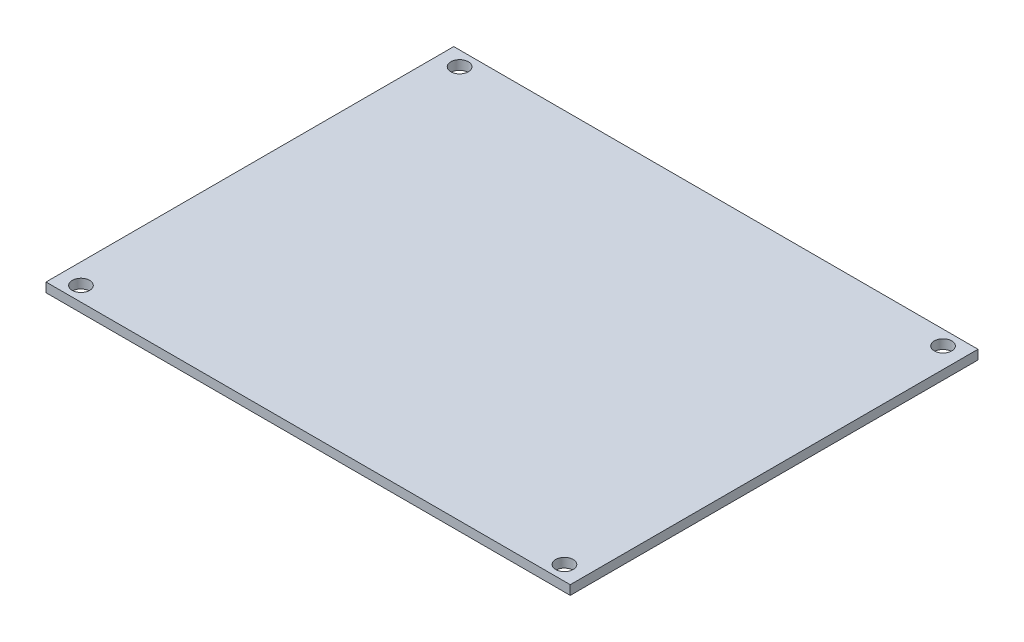
ISO-10303-21;
HEADER;
FILE_DESCRIPTION(('STEP AP214'),'2;1');
FILE_NAME('part.step','',(''),(''),'','','');
FILE_SCHEMA(('AUTOMOTIVE_DESIGN { 1 0 10303 214 1 1 1 1 }'));
ENDSEC;
DATA;
#1=APPLICATION_CONTEXT('core data for automotive mechanical design processes');
#2=APPLICATION_PROTOCOL_DEFINITION('international standard','automotive_design',2000,#1);
#3=PRODUCT_CONTEXT('',#1,'mechanical');
#4=PRODUCT('Part','Part','',(#3));
#5=PRODUCT_RELATED_PRODUCT_CATEGORY('part','',(#4));
#6=PRODUCT_DEFINITION_FORMATION('','',#4);
#7=PRODUCT_DEFINITION_CONTEXT('part definition',#1,'design');
#8=PRODUCT_DEFINITION('design','',#6,#7);
#9=PRODUCT_DEFINITION_SHAPE('','',#8);
#10=(LENGTH_UNIT() NAMED_UNIT(*) SI_UNIT(.MILLI.,.METRE.));
#11=(NAMED_UNIT(*) PLANE_ANGLE_UNIT() SI_UNIT($,.RADIAN.));
#12=(NAMED_UNIT(*) SI_UNIT($,.STERADIAN.) SOLID_ANGLE_UNIT());
#13=UNCERTAINTY_MEASURE_WITH_UNIT(LENGTH_MEASURE(1.E-05),#10,'distance_accuracy_value','');
#14=(GEOMETRIC_REPRESENTATION_CONTEXT(3) GLOBAL_UNCERTAINTY_ASSIGNED_CONTEXT((#13)) GLOBAL_UNIT_ASSIGNED_CONTEXT((#10,
#11,#12)) REPRESENTATION_CONTEXT('',''));
#15=CARTESIAN_POINT('',(0.,0.,0.));
#16=DIRECTION('',(0.,0.,1.));
#17=DIRECTION('',(1.,0.,0.));
#18=AXIS2_PLACEMENT_3D('',#15,#16,#17);
#19=CARTESIAN_POINT('',(45.,1.6,35.));
#20=DIRECTION('',(-1.,0.,0.));
#21=DIRECTION('',(0.,0.,1.));
#22=AXIS2_PLACEMENT_3D('',#19,#20,#21);
#23=PLANE('',#22);
#24=DIRECTION('',(0.,0.,-1.));
#25=VECTOR('',#24,1.);
#26=CARTESIAN_POINT('',(45.,0.,35.));
#27=LINE('',#26,#25);
#28=CARTESIAN_POINT('',(45.,0.,35.));
#29=VERTEX_POINT('',#28);
#30=CARTESIAN_POINT('',(45.,0.,-35.));
#31=VERTEX_POINT('',#30);
#32=EDGE_CURVE('E96',#29,#31,#27,.T.);
#33=ORIENTED_EDGE('',*,*,#32,.T.);
#34=DIRECTION('',(0.,-1.,0.));
#35=VECTOR('',#34,1.);
#36=CARTESIAN_POINT('',(45.,1.6,-35.));
#37=LINE('',#36,#35);
#38=CARTESIAN_POINT('',(45.,1.6,-35.));
#39=VERTEX_POINT('',#38);
#40=EDGE_CURVE('E11',#39,#31,#37,.T.);
#41=ORIENTED_EDGE('',*,*,#40,.F.);
#42=DIRECTION('',(0.,0.,-1.));
#43=VECTOR('',#42,1.);
#44=CARTESIAN_POINT('',(45.,1.6,35.));
#45=LINE('',#44,#43);
#46=CARTESIAN_POINT('',(45.,1.6,35.));
#47=VERTEX_POINT('',#46);
#48=EDGE_CURVE('E84',#47,#39,#45,.T.);
#49=ORIENTED_EDGE('',*,*,#48,.F.);
#50=DIRECTION('',(0.,-1.,0.));
#51=VECTOR('',#50,1.);
#52=CARTESIAN_POINT('',(45.,1.6,35.));
#53=LINE('',#52,#51);
#54=EDGE_CURVE('E92',#47,#29,#53,.T.);
#55=ORIENTED_EDGE('',*,*,#54,.T.);
#56=EDGE_LOOP('',(#33,#41,#49,#55));
#57=FACE_BOUND('',#56,.T.);
#58=ADVANCED_FACE('F33',(#57),#23,.F.);
#59=CARTESIAN_POINT('',(-45.,1.6,-35.));
#60=DIRECTION('',(0.,0.,1.));
#61=DIRECTION('',(1.,0.,0.));
#62=AXIS2_PLACEMENT_3D('',#59,#60,#61);
#63=PLANE('',#62);
#64=DIRECTION('',(-1.,0.,0.));
#65=VECTOR('',#64,1.);
#66=CARTESIAN_POINT('',(-45.,0.,-35.));
#67=LINE('',#66,#65);
#68=CARTESIAN_POINT('',(-45.,0.,-35.));
#69=VERTEX_POINT('',#68);
#70=EDGE_CURVE('E88',#31,#69,#67,.T.);
#71=ORIENTED_EDGE('',*,*,#70,.T.);
#72=DIRECTION('',(0.,-1.,0.));
#73=VECTOR('',#72,1.);
#74=CARTESIAN_POINT('',(-45.,1.6,-35.));
#75=LINE('',#74,#73);
#76=CARTESIAN_POINT('',(-45.,1.6,-35.));
#77=VERTEX_POINT('',#76);
#78=EDGE_CURVE('E41',#77,#69,#75,.T.);
#79=ORIENTED_EDGE('',*,*,#78,.F.);
#80=DIRECTION('',(-1.,0.,0.));
#81=VECTOR('',#80,1.);
#82=CARTESIAN_POINT('',(-45.,1.6,-35.));
#83=LINE('',#82,#81);
#84=EDGE_CURVE('E79',#39,#77,#83,.T.);
#85=ORIENTED_EDGE('',*,*,#84,.F.);
#86=ORIENTED_EDGE('',*,*,#40,.T.);
#87=EDGE_LOOP('',(#71,#79,#85,#86));
#88=FACE_BOUND('',#87,.T.);
#89=ADVANCED_FACE('F87',(#88),#63,.F.);
#90=CARTESIAN_POINT('',(-45.,1.6,35.));
#91=DIRECTION('',(1.,0.,0.));
#92=DIRECTION('',(0.,0.,-1.));
#93=AXIS2_PLACEMENT_3D('',#90,#91,#92);
#94=PLANE('',#93);
#95=DIRECTION('',(0.,0.,1.));
#96=VECTOR('',#95,1.);
#97=CARTESIAN_POINT('',(-45.,0.,35.));
#98=LINE('',#97,#96);
#99=CARTESIAN_POINT('',(-45.,0.,35.));
#100=VERTEX_POINT('',#99);
#101=EDGE_CURVE('E66',#69,#100,#98,.T.);
#102=ORIENTED_EDGE('',*,*,#101,.T.);
#103=DIRECTION('',(0.,-1.,0.));
#104=VECTOR('',#103,1.);
#105=CARTESIAN_POINT('',(-45.,1.6,35.));
#106=LINE('',#105,#104);
#107=CARTESIAN_POINT('',(-45.,1.6,35.));
#108=VERTEX_POINT('',#107);
#109=EDGE_CURVE('E89',#108,#100,#106,.T.);
#110=ORIENTED_EDGE('',*,*,#109,.F.);
#111=DIRECTION('',(0.,0.,1.));
#112=VECTOR('',#111,1.);
#113=CARTESIAN_POINT('',(-45.,1.6,35.));
#114=LINE('',#113,#112);
#115=EDGE_CURVE('E82',#77,#108,#114,.T.);
#116=ORIENTED_EDGE('',*,*,#115,.F.);
#117=ORIENTED_EDGE('',*,*,#78,.T.);
#118=EDGE_LOOP('',(#102,#110,#116,#117));
#119=FACE_BOUND('',#118,.T.);
#120=ADVANCED_FACE('F90',(#119),#94,.F.);
#121=CARTESIAN_POINT('',(-45.,1.6,35.));
#122=DIRECTION('',(0.,0.,-1.));
#123=DIRECTION('',(-1.,0.,0.));
#124=AXIS2_PLACEMENT_3D('',#121,#122,#123);
#125=PLANE('',#124);
#126=DIRECTION('',(1.,0.,0.));
#127=VECTOR('',#126,1.);
#128=CARTESIAN_POINT('',(-45.,0.,35.));
#129=LINE('',#128,#127);
#130=EDGE_CURVE('E72',#100,#29,#129,.T.);
#131=ORIENTED_EDGE('',*,*,#130,.T.);
#132=ORIENTED_EDGE('',*,*,#54,.F.);
#133=DIRECTION('',(1.,0.,0.));
#134=VECTOR('',#133,1.);
#135=CARTESIAN_POINT('',(-45.,1.6,35.));
#136=LINE('',#135,#134);
#137=EDGE_CURVE('E49',#108,#47,#136,.T.);
#138=ORIENTED_EDGE('',*,*,#137,.F.);
#139=ORIENTED_EDGE('',*,*,#109,.T.);
#140=EDGE_LOOP('',(#131,#132,#138,#139));
#141=FACE_BOUND('',#140,.T.);
#142=ADVANCED_FACE('F104',(#141),#125,.F.);
#143=CARTESIAN_POINT('',(0.,1.6,0.));
#144=DIRECTION('',(0.,-1.,0.));
#145=DIRECTION('',(0.,0.,-1.));
#146=AXIS2_PLACEMENT_3D('',#143,#144,#145);
#147=PLANE('',#146);
#148=CARTESIAN_POINT('',(-41.5,1.6,32.5));
#149=DIRECTION('',(0.,1.,0.));
#150=DIRECTION('',(0.,0.,1.));
#151=AXIS2_PLACEMENT_3D('',#148,#149,#150);
#152=CIRCLE('',#151,1.5);
#153=CARTESIAN_POINT('',(-41.5,1.6,34.));
#154=VERTEX_POINT('',#153);
#155=EDGE_CURVE('E116',#154,#154,#152,.T.);
#156=ORIENTED_EDGE('',*,*,#155,.F.);
#157=EDGE_LOOP('',(#156));
#158=FACE_BOUND('',#157,.T.);
#159=CARTESIAN_POINT('',(41.5000000000006,1.6,32.5));
#160=DIRECTION('',(0.,1.,0.));
#161=DIRECTION('',(0.,0.,1.));
#162=AXIS2_PLACEMENT_3D('',#159,#160,#161);
#163=CIRCLE('',#162,1.5);
#164=CARTESIAN_POINT('',(41.5000000000006,1.6,34.));
#165=VERTEX_POINT('',#164);
#166=EDGE_CURVE('E122',#165,#165,#163,.T.);
#167=ORIENTED_EDGE('',*,*,#166,.F.);
#168=EDGE_LOOP('',(#167));
#169=FACE_BOUND('',#168,.T.);
#170=CARTESIAN_POINT('',(41.5000000000006,1.6,-32.5));
#171=DIRECTION('',(0.,1.,0.));
#172=DIRECTION('',(0.,0.,1.));
#173=AXIS2_PLACEMENT_3D('',#170,#171,#172);
#174=CIRCLE('',#173,1.5);
#175=CARTESIAN_POINT('',(41.5000000000006,1.6,-31.));
#176=VERTEX_POINT('',#175);
#177=EDGE_CURVE('E128',#176,#176,#174,.T.);
#178=ORIENTED_EDGE('',*,*,#177,.F.);
#179=EDGE_LOOP('',(#178));
#180=FACE_BOUND('',#179,.T.);
#181=CARTESIAN_POINT('',(-41.5,1.6,-32.5));
#182=DIRECTION('',(0.,1.,0.));
#183=DIRECTION('',(0.,0.,1.));
#184=AXIS2_PLACEMENT_3D('',#181,#182,#183);
#185=CIRCLE('',#184,1.5);
#186=CARTESIAN_POINT('',(-41.5,1.6,-31.));
#187=VERTEX_POINT('',#186);
#188=EDGE_CURVE('E110',#187,#187,#185,.T.);
#189=ORIENTED_EDGE('',*,*,#188,.F.);
#190=EDGE_LOOP('',(#189));
#191=FACE_BOUND('',#190,.T.);
#192=ORIENTED_EDGE('',*,*,#48,.T.);
#193=ORIENTED_EDGE('',*,*,#84,.T.);
#194=ORIENTED_EDGE('',*,*,#115,.T.);
#195=ORIENTED_EDGE('',*,*,#137,.T.);
#196=EDGE_LOOP('',(#192,#193,#194,#195));
#197=FACE_BOUND('',#196,.T.);
#198=ADVANCED_FACE('F80',(#158,#169,#180,#191,#197),#147,.F.);
#199=CARTESIAN_POINT('',(0.,0.,0.));
#200=DIRECTION('',(0.,-1.,0.));
#201=DIRECTION('',(0.,0.,-1.));
#202=AXIS2_PLACEMENT_3D('',#199,#200,#201);
#203=PLANE('',#202);
#204=CARTESIAN_POINT('',(-41.5,0.,32.5));
#205=DIRECTION('',(0.,1.,0.));
#206=DIRECTION('',(0.,0.,1.));
#207=AXIS2_PLACEMENT_3D('',#204,#205,#206);
#208=CIRCLE('',#207,1.5);
#209=CARTESIAN_POINT('',(-41.5,0.,34.));
#210=VERTEX_POINT('',#209);
#211=EDGE_CURVE('E119',#210,#210,#208,.T.);
#212=ORIENTED_EDGE('',*,*,#211,.T.);
#213=EDGE_LOOP('',(#212));
#214=FACE_BOUND('',#213,.T.);
#215=CARTESIAN_POINT('',(41.5000000000006,0.,32.5));
#216=DIRECTION('',(0.,1.,0.));
#217=DIRECTION('',(0.,0.,1.));
#218=AXIS2_PLACEMENT_3D('',#215,#216,#217);
#219=CIRCLE('',#218,1.5);
#220=CARTESIAN_POINT('',(41.5000000000006,0.,34.));
#221=VERTEX_POINT('',#220);
#222=EDGE_CURVE('E125',#221,#221,#219,.T.);
#223=ORIENTED_EDGE('',*,*,#222,.T.);
#224=EDGE_LOOP('',(#223));
#225=FACE_BOUND('',#224,.T.);
#226=CARTESIAN_POINT('',(41.5000000000006,0.,-32.5));
#227=DIRECTION('',(0.,1.,0.));
#228=DIRECTION('',(0.,0.,1.));
#229=AXIS2_PLACEMENT_3D('',#226,#227,#228);
#230=CIRCLE('',#229,1.5);
#231=CARTESIAN_POINT('',(41.5000000000006,0.,-31.));
#232=VERTEX_POINT('',#231);
#233=EDGE_CURVE('E113',#232,#232,#230,.T.);
#234=ORIENTED_EDGE('',*,*,#233,.T.);
#235=EDGE_LOOP('',(#234));
#236=FACE_BOUND('',#235,.T.);
#237=CARTESIAN_POINT('',(-41.5,0.,-32.5));
#238=DIRECTION('',(0.,1.,0.));
#239=DIRECTION('',(0.,0.,1.));
#240=AXIS2_PLACEMENT_3D('',#237,#238,#239);
#241=CIRCLE('',#240,1.5);
#242=CARTESIAN_POINT('',(-41.5,0.,-31.));
#243=VERTEX_POINT('',#242);
#244=EDGE_CURVE('E99',#243,#243,#241,.T.);
#245=ORIENTED_EDGE('',*,*,#244,.T.);
#246=EDGE_LOOP('',(#245));
#247=FACE_BOUND('',#246,.T.);
#248=ORIENTED_EDGE('',*,*,#32,.F.);
#249=ORIENTED_EDGE('',*,*,#130,.F.);
#250=ORIENTED_EDGE('',*,*,#101,.F.);
#251=ORIENTED_EDGE('',*,*,#70,.F.);
#252=EDGE_LOOP('',(#248,#249,#250,#251));
#253=FACE_BOUND('',#252,.T.);
#254=ADVANCED_FACE('F107',(#214,#225,#236,#247,#253),#203,.T.);
#255=CARTESIAN_POINT('',(-41.5,0.,-32.5));
#256=DIRECTION('',(0.,1.,0.));
#257=DIRECTION('',(0.,0.,1.));
#258=AXIS2_PLACEMENT_3D('',#255,#256,#257);
#259=CYLINDRICAL_SURFACE('',#258,1.5);
#260=ORIENTED_EDGE('',*,*,#244,.F.);
#261=EDGE_LOOP('',(#260));
#262=FACE_BOUND('',#261,.T.);
#263=ORIENTED_EDGE('',*,*,#188,.T.);
#264=EDGE_LOOP('',(#263));
#265=FACE_BOUND('',#264,.T.);
#266=ADVANCED_FACE('F140',(#262,#265),#259,.F.);
#267=CARTESIAN_POINT('',(41.5000000000006,0.,-32.5));
#268=DIRECTION('',(0.,1.,0.));
#269=DIRECTION('',(0.,0.,1.));
#270=AXIS2_PLACEMENT_3D('',#267,#268,#269);
#271=CYLINDRICAL_SURFACE('',#270,1.5);
#272=ORIENTED_EDGE('',*,*,#233,.F.);
#273=EDGE_LOOP('',(#272));
#274=FACE_BOUND('',#273,.T.);
#275=ORIENTED_EDGE('',*,*,#177,.T.);
#276=EDGE_LOOP('',(#275));
#277=FACE_BOUND('',#276,.T.);
#278=ADVANCED_FACE('F136',(#274,#277),#271,.F.);
#279=CARTESIAN_POINT('',(41.5000000000006,0.,32.5));
#280=DIRECTION('',(0.,1.,0.));
#281=DIRECTION('',(0.,0.,1.));
#282=AXIS2_PLACEMENT_3D('',#279,#280,#281);
#283=CYLINDRICAL_SURFACE('',#282,1.5);
#284=ORIENTED_EDGE('',*,*,#222,.F.);
#285=EDGE_LOOP('',(#284));
#286=FACE_BOUND('',#285,.T.);
#287=ORIENTED_EDGE('',*,*,#166,.T.);
#288=EDGE_LOOP('',(#287));
#289=FACE_BOUND('',#288,.T.);
#290=ADVANCED_FACE('F139',(#286,#289),#283,.F.);
#291=CARTESIAN_POINT('',(-41.5,0.,32.5));
#292=DIRECTION('',(0.,1.,0.));
#293=DIRECTION('',(0.,0.,1.));
#294=AXIS2_PLACEMENT_3D('',#291,#292,#293);
#295=CYLINDRICAL_SURFACE('',#294,1.5);
#296=ORIENTED_EDGE('',*,*,#211,.F.);
#297=EDGE_LOOP('',(#296));
#298=FACE_BOUND('',#297,.T.);
#299=ORIENTED_EDGE('',*,*,#155,.T.);
#300=EDGE_LOOP('',(#299));
#301=FACE_BOUND('',#300,.T.);
#302=ADVANCED_FACE('F201',(#298,#301),#295,.F.);
#303=CLOSED_SHELL('',(#58,#89,#120,#142,#198,#254,#266,#278,#290,#302));
#304=MANIFOLD_SOLID_BREP('B2',#303);
#305=ADVANCED_BREP_SHAPE_REPRESENTATION('',(#18,#304),#14);
#306=SHAPE_DEFINITION_REPRESENTATION(#9,#305);
ENDSEC;
END-ISO-10303-21;
